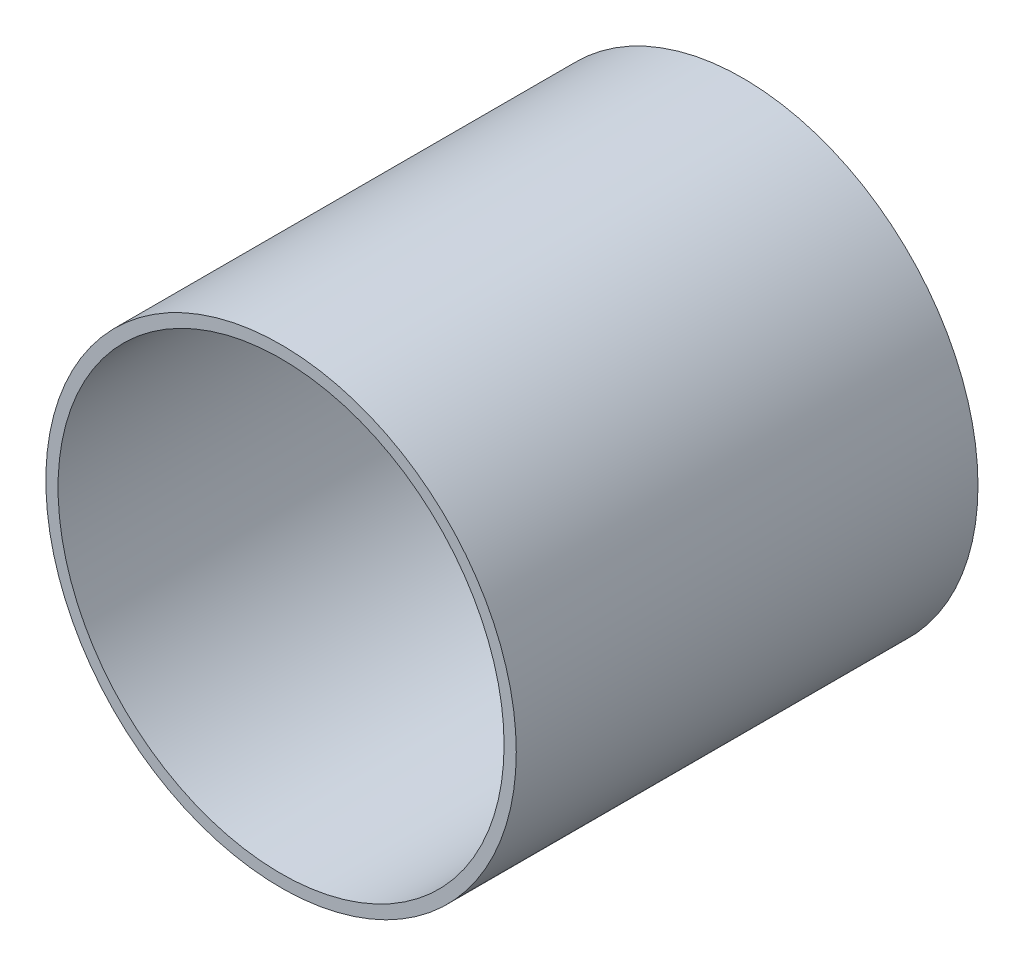
ISO-10303-21;
HEADER;
FILE_DESCRIPTION(('STEP AP214'),'2;1');
FILE_NAME('part.step','',(''),(''),'','','');
FILE_SCHEMA(('AUTOMOTIVE_DESIGN { 1 0 10303 214 1 1 1 1 }'));
ENDSEC;
DATA;
#1=APPLICATION_CONTEXT('core data for automotive mechanical design processes');
#2=APPLICATION_PROTOCOL_DEFINITION('international standard','automotive_design',2000,#1);
#3=PRODUCT_CONTEXT('',#1,'mechanical');
#4=PRODUCT('Part','Part','',(#3));
#5=PRODUCT_RELATED_PRODUCT_CATEGORY('part','',(#4));
#6=PRODUCT_DEFINITION_FORMATION('','',#4);
#7=PRODUCT_DEFINITION_CONTEXT('part definition',#1,'design');
#8=PRODUCT_DEFINITION('design','',#6,#7);
#9=PRODUCT_DEFINITION_SHAPE('','',#8);
#10=(LENGTH_UNIT() NAMED_UNIT(*) SI_UNIT(.MILLI.,.METRE.));
#11=(NAMED_UNIT(*) PLANE_ANGLE_UNIT() SI_UNIT($,.RADIAN.));
#12=(NAMED_UNIT(*) SI_UNIT($,.STERADIAN.) SOLID_ANGLE_UNIT());
#13=UNCERTAINTY_MEASURE_WITH_UNIT(LENGTH_MEASURE(1.E-05),#10,'distance_accuracy_value','');
#14=(GEOMETRIC_REPRESENTATION_CONTEXT(3) GLOBAL_UNCERTAINTY_ASSIGNED_CONTEXT((#13)) GLOBAL_UNIT_ASSIGNED_CONTEXT((#10,
#11,#12)) REPRESENTATION_CONTEXT('',''));
#15=CARTESIAN_POINT('',(0.,0.,0.));
#16=DIRECTION('',(0.,0.,1.));
#17=DIRECTION('',(1.,0.,0.));
#18=AXIS2_PLACEMENT_3D('',#15,#16,#17);
#19=CARTESIAN_POINT('',(0.,0.,53.));
#20=DIRECTION('',(0.,0.,-1.));
#21=DIRECTION('',(-1.,0.,0.));
#22=AXIS2_PLACEMENT_3D('',#19,#20,#21);
#23=CYLINDRICAL_SURFACE('',#22,27.);
#24=CARTESIAN_POINT('',(0.,0.,53.));
#25=DIRECTION('',(0.,0.,1.));
#26=DIRECTION('',(1.,0.,0.));
#27=AXIS2_PLACEMENT_3D('',#24,#25,#26);
#28=CIRCLE('',#27,27.);
#29=CARTESIAN_POINT('',(27.,0.,53.));
#30=VERTEX_POINT('',#29);
#31=EDGE_CURVE('E10',#30,#30,#28,.T.);
#32=ORIENTED_EDGE('',*,*,#31,.F.);
#33=EDGE_LOOP('',(#32));
#34=FACE_BOUND('',#33,.T.);
#35=CARTESIAN_POINT('',(0.,0.,0.));
#36=DIRECTION('',(0.,0.,1.));
#37=DIRECTION('',(1.,0.,0.));
#38=AXIS2_PLACEMENT_3D('',#35,#36,#37);
#39=CIRCLE('',#38,27.);
#40=CARTESIAN_POINT('',(27.,0.,0.));
#41=VERTEX_POINT('',#40);
#42=EDGE_CURVE('E42',#41,#41,#39,.T.);
#43=ORIENTED_EDGE('',*,*,#42,.T.);
#44=EDGE_LOOP('',(#43));
#45=FACE_BOUND('',#44,.T.);
#46=ADVANCED_FACE('F39',(#34,#45),#23,.T.);
#47=CARTESIAN_POINT('',(0.,0.,53.));
#48=DIRECTION('',(0.,0.,1.));
#49=DIRECTION('',(1.,0.,0.));
#50=AXIS2_PLACEMENT_3D('',#47,#48,#49);
#51=PLANE('',#50);
#52=CARTESIAN_POINT('',(0.,0.,53.));
#53=DIRECTION('',(0.,0.,1.));
#54=DIRECTION('',(1.,0.,0.));
#55=AXIS2_PLACEMENT_3D('',#52,#53,#54);
#56=CIRCLE('',#55,25.6);
#57=CARTESIAN_POINT('',(25.6,0.,53.));
#58=VERTEX_POINT('',#57);
#59=EDGE_CURVE('E51',#58,#58,#56,.T.);
#60=ORIENTED_EDGE('',*,*,#59,.F.);
#61=EDGE_LOOP('',(#60));
#62=FACE_BOUND('',#61,.T.);
#63=ORIENTED_EDGE('',*,*,#31,.T.);
#64=EDGE_LOOP('',(#63));
#65=FACE_BOUND('',#64,.T.);
#66=ADVANCED_FACE('F73',(#62,#65),#51,.T.);
#67=CARTESIAN_POINT('',(0.,0.,0.));
#68=DIRECTION('',(0.,0.,1.));
#69=DIRECTION('',(1.,0.,0.));
#70=AXIS2_PLACEMENT_3D('',#67,#68,#69);
#71=PLANE('',#70);
#72=ORIENTED_EDGE('',*,*,#42,.F.);
#73=EDGE_LOOP('',(#72));
#74=FACE_BOUND('',#73,.T.);
#75=ADVANCED_FACE('F65',(#74),#71,.F.);
#76=CARTESIAN_POINT('',(0.,0.,53.));
#77=DIRECTION('',(0.,0.,-1.));
#78=DIRECTION('',(-1.,0.,0.));
#79=AXIS2_PLACEMENT_3D('',#76,#77,#78);
#80=CYLINDRICAL_SURFACE('',#79,25.6);
#81=ORIENTED_EDGE('',*,*,#59,.T.);
#82=EDGE_LOOP('',(#81));
#83=FACE_BOUND('',#82,.T.);
#84=CARTESIAN_POINT('',(0.,0.,1.4));
#85=DIRECTION('',(0.,0.,1.));
#86=DIRECTION('',(1.,0.,0.));
#87=AXIS2_PLACEMENT_3D('',#84,#85,#86);
#88=CIRCLE('',#87,25.6);
#89=CARTESIAN_POINT('',(25.6,0.,1.4));
#90=VERTEX_POINT('',#89);
#91=EDGE_CURVE('E56',#90,#90,#88,.T.);
#92=ORIENTED_EDGE('',*,*,#91,.F.);
#93=EDGE_LOOP('',(#92));
#94=FACE_BOUND('',#93,.T.);
#95=ADVANCED_FACE('F63',(#83,#94),#80,.F.);
#96=CARTESIAN_POINT('',(0.,0.,1.4));
#97=DIRECTION('',(0.,0.,1.));
#98=DIRECTION('',(1.,0.,0.));
#99=AXIS2_PLACEMENT_3D('',#96,#97,#98);
#100=PLANE('',#99);
#101=ORIENTED_EDGE('',*,*,#91,.T.);
#102=EDGE_LOOP('',(#101));
#103=FACE_BOUND('',#102,.T.);
#104=ADVANCED_FACE('F61',(#103),#100,.T.);
#105=CLOSED_SHELL('',(#46,#66,#75,#95,#104));
#106=MANIFOLD_SOLID_BREP('B2',#105);
#107=ADVANCED_BREP_SHAPE_REPRESENTATION('',(#18,#106),#14);
#108=SHAPE_DEFINITION_REPRESENTATION(#9,#107);
ENDSEC;
END-ISO-10303-21;
